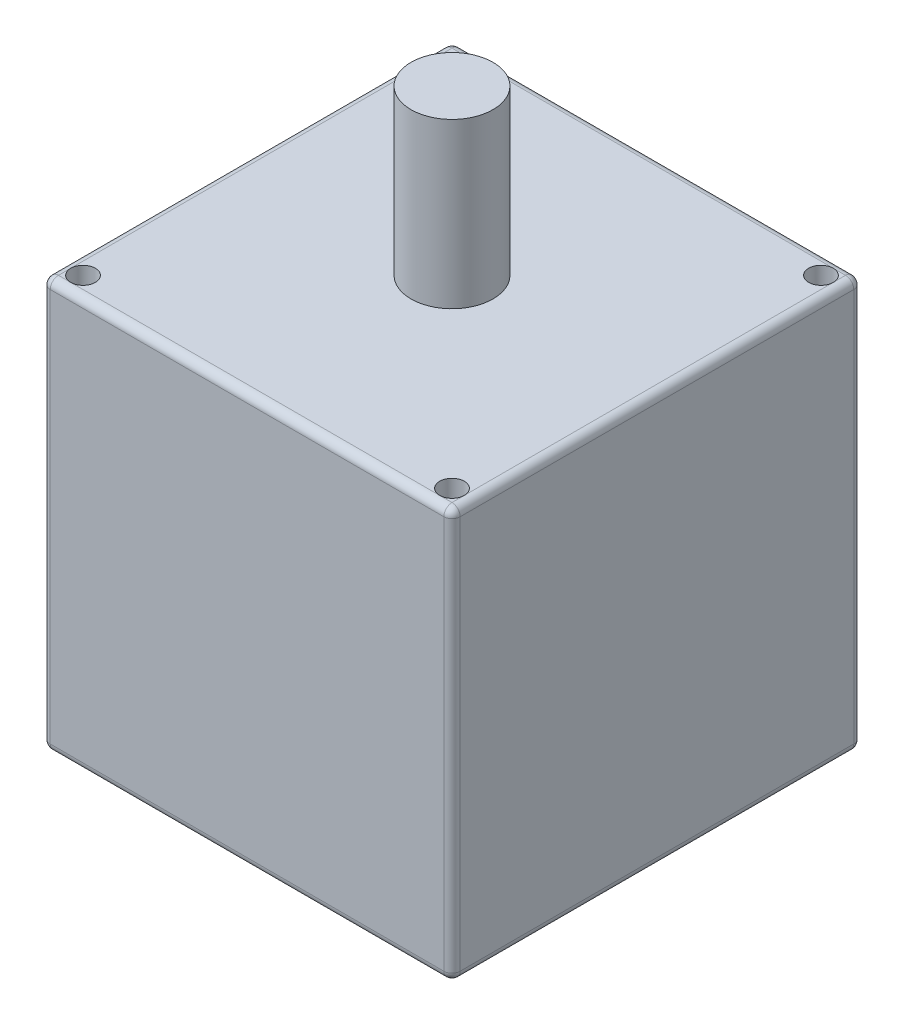
ISO-10303-21;
HEADER;
FILE_DESCRIPTION(('STEP AP214'),'2;1');
FILE_NAME('part.step','',(''),(''),'','','');
FILE_SCHEMA(('AUTOMOTIVE_DESIGN { 1 0 10303 214 1 1 1 1 }'));
ENDSEC;
DATA;
#1=APPLICATION_CONTEXT('core data for automotive mechanical design processes');
#2=APPLICATION_PROTOCOL_DEFINITION('international standard','automotive_design',2000,#1);
#3=PRODUCT_CONTEXT('',#1,'mechanical');
#4=PRODUCT('Part','Part','',(#3));
#5=PRODUCT_RELATED_PRODUCT_CATEGORY('part','',(#4));
#6=PRODUCT_DEFINITION_FORMATION('','',#4);
#7=PRODUCT_DEFINITION_CONTEXT('part definition',#1,'design');
#8=PRODUCT_DEFINITION('design','',#6,#7);
#9=PRODUCT_DEFINITION_SHAPE('','',#8);
#10=(LENGTH_UNIT() NAMED_UNIT(*) SI_UNIT(.MILLI.,.METRE.));
#11=(NAMED_UNIT(*) PLANE_ANGLE_UNIT() SI_UNIT($,.RADIAN.));
#12=(NAMED_UNIT(*) SI_UNIT($,.STERADIAN.) SOLID_ANGLE_UNIT());
#13=UNCERTAINTY_MEASURE_WITH_UNIT(LENGTH_MEASURE(1.E-05),#10,'distance_accuracy_value','');
#14=(GEOMETRIC_REPRESENTATION_CONTEXT(3) GLOBAL_UNCERTAINTY_ASSIGNED_CONTEXT((#13)) GLOBAL_UNIT_ASSIGNED_CONTEXT((#10,
#11,#12)) REPRESENTATION_CONTEXT('',''));
#15=CARTESIAN_POINT('',(0.,0.,0.));
#16=DIRECTION('',(0.,0.,1.));
#17=DIRECTION('',(1.,0.,0.));
#18=AXIS2_PLACEMENT_3D('',#15,#16,#17);
#19=CARTESIAN_POINT('',(0.,50.,0.));
#20=DIRECTION('',(0.,1.,0.));
#21=DIRECTION('',(0.,0.,1.));
#22=AXIS2_PLACEMENT_3D('',#19,#20,#21);
#23=PLANE('',#22);
#24=CARTESIAN_POINT('',(-22.5,50.,-22.5));
#25=DIRECTION('',(0.,1.,0.));
#26=DIRECTION('',(0.,0.,1.));
#27=AXIS2_PLACEMENT_3D('',#24,#25,#26);
#28=CIRCLE('',#27,1.49999999999999);
#29=CARTESIAN_POINT('',(-22.5,50.,-24.));
#30=VERTEX_POINT('',#29);
#31=CARTESIAN_POINT('',(-24.,50.,-22.5));
#32=VERTEX_POINT('',#31);
#33=EDGE_CURVE('E53',#30,#32,#28,.T.);
#34=ORIENTED_EDGE('',*,*,#33,.F.);
#35=DIRECTION('',(-1.,0.,0.));
#36=VECTOR('',#35,1.);
#37=CARTESIAN_POINT('',(-25.,50.,-24.));
#38=LINE('',#37,#36);
#39=CARTESIAN_POINT('',(-24.,50.,-24.));
#40=VERTEX_POINT('',#39);
#41=EDGE_CURVE('E245',#30,#40,#38,.T.);
#42=ORIENTED_EDGE('',*,*,#41,.T.);
#43=DIRECTION('',(0.,0.,1.));
#44=VECTOR('',#43,1.);
#45=CARTESIAN_POINT('',(-24.,50.,25.));
#46=LINE('',#45,#44);
#47=EDGE_CURVE('E252',#40,#32,#46,.T.);
#48=ORIENTED_EDGE('',*,*,#47,.T.);
#49=EDGE_LOOP('',(#34,#42,#48));
#50=FACE_BOUND('',#49,.T.);
#51=ADVANCED_FACE('F36',(#50),#23,.T.);
#52=CARTESIAN_POINT('',(22.5,50.,-22.5));
#53=DIRECTION('',(0.,1.,0.));
#54=DIRECTION('',(0.,0.,1.));
#55=AXIS2_PLACEMENT_3D('',#52,#53,#54);
#56=CIRCLE('',#55,1.49999999999999);
#57=CARTESIAN_POINT('',(24.,50.,-22.5));
#58=VERTEX_POINT('',#57);
#59=CARTESIAN_POINT('',(22.5,50.,-24.));
#60=VERTEX_POINT('',#59);
#61=EDGE_CURVE('E60',#58,#60,#56,.T.);
#62=ORIENTED_EDGE('',*,*,#61,.F.);
#63=DIRECTION('',(0.,0.,-1.));
#64=VECTOR('',#63,1.);
#65=CARTESIAN_POINT('',(24.,50.,-25.));
#66=LINE('',#65,#64);
#67=CARTESIAN_POINT('',(24.,50.,-24.));
#68=VERTEX_POINT('',#67);
#69=EDGE_CURVE('E241',#58,#68,#66,.T.);
#70=ORIENTED_EDGE('',*,*,#69,.T.);
#71=EDGE_CURVE('E247',#68,#60,#38,.T.);
#72=ORIENTED_EDGE('',*,*,#71,.T.);
#73=EDGE_LOOP('',(#62,#70,#72));
#74=FACE_BOUND('',#73,.T.);
#75=ADVANCED_FACE('F374',(#74),#23,.T.);
#76=CARTESIAN_POINT('',(22.5,50.,22.5));
#77=DIRECTION('',(0.,1.,0.));
#78=DIRECTION('',(0.,0.,1.));
#79=AXIS2_PLACEMENT_3D('',#76,#77,#78);
#80=CIRCLE('',#79,1.49999999999999);
#81=CARTESIAN_POINT('',(22.5,50.,24.));
#82=VERTEX_POINT('',#81);
#83=CARTESIAN_POINT('',(24.,50.,22.5));
#84=VERTEX_POINT('',#83);
#85=EDGE_CURVE('E183',#82,#84,#80,.T.);
#86=ORIENTED_EDGE('',*,*,#85,.F.);
#87=DIRECTION('',(1.,0.,0.));
#88=VECTOR('',#87,1.);
#89=CARTESIAN_POINT('',(25.,50.,24.));
#90=LINE('',#89,#88);
#91=CARTESIAN_POINT('',(24.,50.,24.));
#92=VERTEX_POINT('',#91);
#93=EDGE_CURVE('E47',#82,#92,#90,.T.);
#94=ORIENTED_EDGE('',*,*,#93,.T.);
#95=EDGE_CURVE('E242',#92,#84,#66,.T.);
#96=ORIENTED_EDGE('',*,*,#95,.T.);
#97=EDGE_LOOP('',(#86,#94,#96));
#98=FACE_BOUND('',#97,.T.);
#99=ADVANCED_FACE('F383',(#98),#23,.T.);
#100=CARTESIAN_POINT('',(0.,50.,0.));
#101=DIRECTION('',(0.,1.,0.));
#102=DIRECTION('',(0.,0.,1.));
#103=AXIS2_PLACEMENT_3D('',#100,#101,#102);
#104=CIRCLE('',#103,5.);
#105=CARTESIAN_POINT('',(0.,50.,5.));
#106=VERTEX_POINT('',#105);
#107=EDGE_CURVE('E431',#106,#106,#104,.T.);
#108=ORIENTED_EDGE('',*,*,#107,.F.);
#109=EDGE_LOOP('',(#108));
#110=FACE_BOUND('',#109,.T.);
#111=EDGE_CURVE('E175',#32,#30,#28,.T.);
#112=ORIENTED_EDGE('',*,*,#111,.F.);
#113=CARTESIAN_POINT('',(-24.,50.,22.5));
#114=VERTEX_POINT('',#113);
#115=EDGE_CURVE('E254',#32,#114,#46,.T.);
#116=ORIENTED_EDGE('',*,*,#115,.T.);
#117=CARTESIAN_POINT('',(-22.5,50.,22.5));
#118=DIRECTION('',(0.,1.,0.));
#119=DIRECTION('',(0.,0.,1.));
#120=AXIS2_PLACEMENT_3D('',#117,#118,#119);
#121=CIRCLE('',#120,1.49999999999999);
#122=CARTESIAN_POINT('',(-22.5,50.,24.));
#123=VERTEX_POINT('',#122);
#124=EDGE_CURVE('E189',#123,#114,#121,.T.);
#125=ORIENTED_EDGE('',*,*,#124,.F.);
#126=EDGE_CURVE('E45',#123,#82,#90,.T.);
#127=ORIENTED_EDGE('',*,*,#126,.T.);
#128=EDGE_CURVE('E182',#84,#82,#80,.T.);
#129=ORIENTED_EDGE('',*,*,#128,.F.);
#130=EDGE_CURVE('E246',#84,#58,#66,.T.);
#131=ORIENTED_EDGE('',*,*,#130,.T.);
#132=EDGE_CURVE('E172',#60,#58,#56,.T.);
#133=ORIENTED_EDGE('',*,*,#132,.F.);
#134=EDGE_CURVE('E251',#60,#30,#38,.T.);
#135=ORIENTED_EDGE('',*,*,#134,.T.);
#136=EDGE_LOOP('',(#112,#116,#125,#127,#129,#131,#133,#135));
#137=FACE_BOUND('',#136,.T.);
#138=ADVANCED_FACE('F379',(#110,#137),#23,.T.);
#139=CARTESIAN_POINT('',(25.,50.,-25.));
#140=DIRECTION('',(-1.,0.,0.));
#141=DIRECTION('',(0.,0.,1.));
#142=AXIS2_PLACEMENT_3D('',#139,#140,#141);
#143=PLANE('',#142);
#144=DIRECTION('',(0.,0.,-1.));
#145=VECTOR('',#144,1.);
#146=CARTESIAN_POINT('',(25.,1.,-25.));
#147=LINE('',#146,#145);
#148=CARTESIAN_POINT('',(25.,1.,24.));
#149=VERTEX_POINT('',#148);
#150=CARTESIAN_POINT('',(25.,1.,-24.));
#151=VERTEX_POINT('',#150);
#152=EDGE_CURVE('E227',#149,#151,#147,.T.);
#153=ORIENTED_EDGE('',*,*,#152,.T.);
#154=DIRECTION('',(0.,-1.,0.));
#155=VECTOR('',#154,1.);
#156=CARTESIAN_POINT('',(25.,50.,-24.));
#157=LINE('',#156,#155);
#158=CARTESIAN_POINT('',(25.,49.,-24.));
#159=VERTEX_POINT('',#158);
#160=EDGE_CURVE('E229',#151,#159,#157,.F.);
#161=ORIENTED_EDGE('',*,*,#160,.T.);
#162=DIRECTION('',(0.,0.,-1.));
#163=VECTOR('',#162,1.);
#164=CARTESIAN_POINT('',(25.,49.,25.));
#165=LINE('',#164,#163);
#166=CARTESIAN_POINT('',(25.,49.,24.));
#167=VERTEX_POINT('',#166);
#168=EDGE_CURVE('E223',#159,#167,#165,.F.);
#169=ORIENTED_EDGE('',*,*,#168,.T.);
#170=DIRECTION('',(0.,-1.,0.));
#171=VECTOR('',#170,1.);
#172=CARTESIAN_POINT('',(25.,50.,24.));
#173=LINE('',#172,#171);
#174=EDGE_CURVE('E225',#167,#149,#173,.T.);
#175=ORIENTED_EDGE('',*,*,#174,.T.);
#176=EDGE_LOOP('',(#153,#161,#169,#175));
#177=FACE_BOUND('',#176,.T.);
#178=ADVANCED_FACE('F335',(#177),#143,.F.);
#179=CARTESIAN_POINT('',(-25.,50.,-25.));
#180=DIRECTION('',(0.,0.,1.));
#181=DIRECTION('',(1.,0.,0.));
#182=AXIS2_PLACEMENT_3D('',#179,#180,#181);
#183=PLANE('',#182);
#184=DIRECTION('',(-1.,0.,0.));
#185=VECTOR('',#184,1.);
#186=CARTESIAN_POINT('',(-25.,1.,-25.));
#187=LINE('',#186,#185);
#188=CARTESIAN_POINT('',(24.,1.,-25.));
#189=VERTEX_POINT('',#188);
#190=CARTESIAN_POINT('',(-24.,1.,-25.));
#191=VERTEX_POINT('',#190);
#192=EDGE_CURVE('E218',#189,#191,#187,.T.);
#193=ORIENTED_EDGE('',*,*,#192,.T.);
#194=DIRECTION('',(0.,-1.,0.));
#195=VECTOR('',#194,1.);
#196=CARTESIAN_POINT('',(-24.,50.,-25.));
#197=LINE('',#196,#195);
#198=CARTESIAN_POINT('',(-24.,49.,-25.));
#199=VERTEX_POINT('',#198);
#200=EDGE_CURVE('E220',#191,#199,#197,.F.);
#201=ORIENTED_EDGE('',*,*,#200,.T.);
#202=DIRECTION('',(-1.,0.,0.));
#203=VECTOR('',#202,1.);
#204=CARTESIAN_POINT('',(25.,49.,-25.));
#205=LINE('',#204,#203);
#206=CARTESIAN_POINT('',(24.,49.,-25.));
#207=VERTEX_POINT('',#206);
#208=EDGE_CURVE('E214',#199,#207,#205,.F.);
#209=ORIENTED_EDGE('',*,*,#208,.T.);
#210=DIRECTION('',(0.,-1.,0.));
#211=VECTOR('',#210,1.);
#212=CARTESIAN_POINT('',(24.,50.,-25.));
#213=LINE('',#212,#211);
#214=EDGE_CURVE('E216',#207,#189,#213,.T.);
#215=ORIENTED_EDGE('',*,*,#214,.T.);
#216=EDGE_LOOP('',(#193,#201,#209,#215));
#217=FACE_BOUND('',#216,.T.);
#218=ADVANCED_FACE('F356',(#217),#183,.F.);
#219=CARTESIAN_POINT('',(-25.,50.,-25.));
#220=DIRECTION('',(1.,0.,0.));
#221=DIRECTION('',(0.,0.,-1.));
#222=AXIS2_PLACEMENT_3D('',#219,#220,#221);
#223=PLANE('',#222);
#224=DIRECTION('',(0.,-1.,0.));
#225=VECTOR('',#224,1.);
#226=CARTESIAN_POINT('',(-25.,50.,-24.));
#227=LINE('',#226,#225);
#228=CARTESIAN_POINT('',(-25.,49.,-24.));
#229=VERTEX_POINT('',#228);
#230=CARTESIAN_POINT('',(-25.,1.,-24.));
#231=VERTEX_POINT('',#230);
#232=EDGE_CURVE('E200',#229,#231,#227,.T.);
#233=ORIENTED_EDGE('',*,*,#232,.T.);
#234=DIRECTION('',(0.,0.,1.));
#235=VECTOR('',#234,1.);
#236=CARTESIAN_POINT('',(-25.,1.,-25.));
#237=LINE('',#236,#235);
#238=CARTESIAN_POINT('',(-25.,1.,24.));
#239=VERTEX_POINT('',#238);
#240=EDGE_CURVE('E202',#231,#239,#237,.T.);
#241=ORIENTED_EDGE('',*,*,#240,.T.);
#242=DIRECTION('',(0.,-1.,0.));
#243=VECTOR('',#242,1.);
#244=CARTESIAN_POINT('',(-25.,50.,24.));
#245=LINE('',#244,#243);
#246=CARTESIAN_POINT('',(-25.,49.,24.));
#247=VERTEX_POINT('',#246);
#248=EDGE_CURVE('E198',#239,#247,#245,.F.);
#249=ORIENTED_EDGE('',*,*,#248,.T.);
#250=DIRECTION('',(0.,0.,1.));
#251=VECTOR('',#250,1.);
#252=CARTESIAN_POINT('',(-25.,49.,-25.));
#253=LINE('',#252,#251);
#254=EDGE_CURVE('E196',#247,#229,#253,.F.);
#255=ORIENTED_EDGE('',*,*,#254,.T.);
#256=EDGE_LOOP('',(#233,#241,#249,#255));
#257=FACE_BOUND('',#256,.T.);
#258=ADVANCED_FACE('F420',(#257),#223,.F.);
#259=CARTESIAN_POINT('',(-25.,50.,25.));
#260=DIRECTION('',(0.,0.,-1.));
#261=DIRECTION('',(-1.,0.,0.));
#262=AXIS2_PLACEMENT_3D('',#259,#260,#261);
#263=PLANE('',#262);
#264=DIRECTION('',(0.,-1.,0.));
#265=VECTOR('',#264,1.);
#266=CARTESIAN_POINT('',(-24.,50.,25.));
#267=LINE('',#266,#265);
#268=CARTESIAN_POINT('',(-24.,49.,25.));
#269=VERTEX_POINT('',#268);
#270=CARTESIAN_POINT('',(-24.,1.,25.));
#271=VERTEX_POINT('',#270);
#272=EDGE_CURVE('E236',#269,#271,#267,.T.);
#273=ORIENTED_EDGE('',*,*,#272,.T.);
#274=DIRECTION('',(1.,0.,0.));
#275=VECTOR('',#274,1.);
#276=CARTESIAN_POINT('',(-25.,1.,25.));
#277=LINE('',#276,#275);
#278=CARTESIAN_POINT('',(24.,1.,25.));
#279=VERTEX_POINT('',#278);
#280=EDGE_CURVE('E239',#271,#279,#277,.T.);
#281=ORIENTED_EDGE('',*,*,#280,.T.);
#282=DIRECTION('',(0.,-1.,0.));
#283=VECTOR('',#282,1.);
#284=CARTESIAN_POINT('',(24.,50.,25.));
#285=LINE('',#284,#283);
#286=CARTESIAN_POINT('',(24.,49.,25.));
#287=VERTEX_POINT('',#286);
#288=EDGE_CURVE('E234',#279,#287,#285,.F.);
#289=ORIENTED_EDGE('',*,*,#288,.T.);
#290=DIRECTION('',(1.,0.,0.));
#291=VECTOR('',#290,1.);
#292=CARTESIAN_POINT('',(-25.,49.,25.));
#293=LINE('',#292,#291);
#294=EDGE_CURVE('E232',#287,#269,#293,.F.);
#295=ORIENTED_EDGE('',*,*,#294,.T.);
#296=EDGE_LOOP('',(#273,#281,#289,#295));
#297=FACE_BOUND('',#296,.T.);
#298=ADVANCED_FACE('F451',(#297),#263,.F.);
#299=EDGE_CURVE('E188',#114,#123,#121,.T.);
#300=ORIENTED_EDGE('',*,*,#299,.F.);
#301=CARTESIAN_POINT('',(-24.,50.,24.));
#302=VERTEX_POINT('',#301);
#303=EDGE_CURVE('E250',#114,#302,#46,.T.);
#304=ORIENTED_EDGE('',*,*,#303,.T.);
#305=EDGE_CURVE('E11',#302,#123,#90,.T.);
#306=ORIENTED_EDGE('',*,*,#305,.T.);
#307=EDGE_LOOP('',(#300,#304,#306));
#308=FACE_BOUND('',#307,.T.);
#309=ADVANCED_FACE('F442',(#308),#23,.T.);
#310=CARTESIAN_POINT('',(0.,0.,0.));
#311=DIRECTION('',(0.,1.,0.));
#312=DIRECTION('',(0.,0.,1.));
#313=AXIS2_PLACEMENT_3D('',#310,#311,#312);
#314=PLANE('',#313);
#315=DIRECTION('',(1.,0.,0.));
#316=VECTOR('',#315,1.);
#317=CARTESIAN_POINT('',(0.,0.,24.));
#318=LINE('',#317,#316);
#319=CARTESIAN_POINT('',(24.,0.,24.));
#320=VERTEX_POINT('',#319);
#321=CARTESIAN_POINT('',(-24.,0.,24.));
#322=VERTEX_POINT('',#321);
#323=EDGE_CURVE('E205',#320,#322,#318,.F.);
#324=ORIENTED_EDGE('',*,*,#323,.T.);
#325=DIRECTION('',(0.,0.,1.));
#326=VECTOR('',#325,1.);
#327=CARTESIAN_POINT('',(-24.,0.,0.));
#328=LINE('',#327,#326);
#329=CARTESIAN_POINT('',(-24.,0.,-24.));
#330=VERTEX_POINT('',#329);
#331=EDGE_CURVE('E211',#322,#330,#328,.F.);
#332=ORIENTED_EDGE('',*,*,#331,.T.);
#333=DIRECTION('',(-1.,0.,0.));
#334=VECTOR('',#333,1.);
#335=CARTESIAN_POINT('',(0.,0.,-24.));
#336=LINE('',#335,#334);
#337=CARTESIAN_POINT('',(24.,0.,-24.));
#338=VERTEX_POINT('',#337);
#339=EDGE_CURVE('E209',#330,#338,#336,.F.);
#340=ORIENTED_EDGE('',*,*,#339,.T.);
#341=DIRECTION('',(0.,0.,-1.));
#342=VECTOR('',#341,1.);
#343=CARTESIAN_POINT('',(24.,0.,0.));
#344=LINE('',#343,#342);
#345=EDGE_CURVE('E207',#338,#320,#344,.F.);
#346=ORIENTED_EDGE('',*,*,#345,.T.);
#347=EDGE_LOOP('',(#324,#332,#340,#346));
#348=FACE_BOUND('',#347,.T.);
#349=ADVANCED_FACE('F405',(#348),#314,.F.);
#350=CARTESIAN_POINT('',(24.,49.,0.));
#351=DIRECTION('',(0.,0.,1.));
#352=DIRECTION('',(1.,0.,0.));
#353=AXIS2_PLACEMENT_3D('',#350,#351,#352);
#354=CYLINDRICAL_SURFACE('',#353,1.);
#355=CARTESIAN_POINT('',(24.,49.,-24.));
#356=DIRECTION('',(0.,0.,-1.));
#357=DIRECTION('',(-1.,0.,0.));
#358=AXIS2_PLACEMENT_3D('',#355,#356,#357);
#359=CIRCLE('',#358,1.);
#360=EDGE_CURVE('E40',#68,#159,#359,.T.);
#361=ORIENTED_EDGE('',*,*,#360,.F.);
#362=ORIENTED_EDGE('',*,*,#69,.F.);
#363=ORIENTED_EDGE('',*,*,#130,.F.);
#364=ORIENTED_EDGE('',*,*,#95,.F.);
#365=CARTESIAN_POINT('',(24.,49.,24.));
#366=DIRECTION('',(0.,0.,1.));
#367=DIRECTION('',(1.,0.,0.));
#368=AXIS2_PLACEMENT_3D('',#365,#366,#367);
#369=CIRCLE('',#368,1.);
#370=EDGE_CURVE('E315',#167,#92,#369,.T.);
#371=ORIENTED_EDGE('',*,*,#370,.F.);
#372=ORIENTED_EDGE('',*,*,#168,.F.);
#373=EDGE_LOOP('',(#361,#362,#363,#364,#371,#372));
#374=FACE_BOUND('',#373,.T.);
#375=ADVANCED_FACE('F38',(#374),#354,.T.);
#376=CARTESIAN_POINT('',(24.,49.,-24.));
#377=DIRECTION('',(0.,0.,1.));
#378=DIRECTION('',(1.,0.,0.));
#379=AXIS2_PLACEMENT_3D('',#376,#377,#378);
#380=SPHERICAL_SURFACE('',#379,1.);
#381=CARTESIAN_POINT('',(24.,49.,-24.));
#382=DIRECTION('',(1.,0.,0.));
#383=DIRECTION('',(0.,0.,-1.));
#384=AXIS2_PLACEMENT_3D('',#381,#382,#383);
#385=CIRCLE('',#384,1.);
#386=EDGE_CURVE('E311',#68,#207,#385,.F.);
#387=ORIENTED_EDGE('',*,*,#386,.F.);
#388=ORIENTED_EDGE('',*,*,#360,.T.);
#389=CARTESIAN_POINT('',(24.,49.,-24.));
#390=DIRECTION('',(0.,1.,0.));
#391=DIRECTION('',(0.,0.,1.));
#392=AXIS2_PLACEMENT_3D('',#389,#390,#391);
#393=CIRCLE('',#392,1.);
#394=EDGE_CURVE('E314',#207,#159,#393,.F.);
#395=ORIENTED_EDGE('',*,*,#394,.F.);
#396=EDGE_LOOP('',(#387,#388,#395));
#397=FACE_BOUND('',#396,.T.);
#398=ADVANCED_FACE('F328',(#397),#380,.T.);
#399=CARTESIAN_POINT('',(24.,49.,24.));
#400=DIRECTION('',(0.,0.,1.));
#401=DIRECTION('',(1.,0.,0.));
#402=AXIS2_PLACEMENT_3D('',#399,#400,#401);
#403=SPHERICAL_SURFACE('',#402,1.);
#404=CARTESIAN_POINT('',(24.,49.,24.));
#405=DIRECTION('',(0.,1.,0.));
#406=DIRECTION('',(0.,0.,1.));
#407=AXIS2_PLACEMENT_3D('',#404,#405,#406);
#408=CIRCLE('',#407,1.);
#409=EDGE_CURVE('E305',#167,#287,#408,.F.);
#410=ORIENTED_EDGE('',*,*,#409,.F.);
#411=ORIENTED_EDGE('',*,*,#370,.T.);
#412=CARTESIAN_POINT('',(24.,49.,24.));
#413=DIRECTION('',(1.,0.,0.));
#414=DIRECTION('',(0.,0.,-1.));
#415=AXIS2_PLACEMENT_3D('',#412,#413,#414);
#416=CIRCLE('',#415,1.);
#417=EDGE_CURVE('E308',#287,#92,#416,.F.);
#418=ORIENTED_EDGE('',*,*,#417,.F.);
#419=EDGE_LOOP('',(#410,#411,#418));
#420=FACE_BOUND('',#419,.T.);
#421=ADVANCED_FACE('F390',(#420),#403,.T.);
#422=CARTESIAN_POINT('',(24.,50.,-24.));
#423=DIRECTION('',(0.,-1.,0.));
#424=DIRECTION('',(0.,0.,-1.));
#425=AXIS2_PLACEMENT_3D('',#422,#423,#424);
#426=CYLINDRICAL_SURFACE('',#425,1.);
#427=ORIENTED_EDGE('',*,*,#394,.T.);
#428=ORIENTED_EDGE('',*,*,#160,.F.);
#429=CARTESIAN_POINT('',(24.,1.,-24.));
#430=DIRECTION('',(0.,-1.,0.));
#431=DIRECTION('',(0.,0.,-1.));
#432=AXIS2_PLACEMENT_3D('',#429,#430,#431);
#433=CIRCLE('',#432,1.);
#434=EDGE_CURVE('E299',#189,#151,#433,.T.);
#435=ORIENTED_EDGE('',*,*,#434,.F.);
#436=ORIENTED_EDGE('',*,*,#214,.F.);
#437=EDGE_LOOP('',(#427,#428,#435,#436));
#438=FACE_BOUND('',#437,.T.);
#439=ADVANCED_FACE('F340',(#438),#426,.T.);
#440=CARTESIAN_POINT('',(0.,49.,-24.));
#441=DIRECTION('',(1.,0.,0.));
#442=DIRECTION('',(0.,0.,-1.));
#443=AXIS2_PLACEMENT_3D('',#440,#441,#442);
#444=CYLINDRICAL_SURFACE('',#443,1.);
#445=ORIENTED_EDGE('',*,*,#386,.T.);
#446=ORIENTED_EDGE('',*,*,#208,.F.);
#447=CARTESIAN_POINT('',(-24.,49.,-24.));
#448=DIRECTION('',(-1.,0.,0.));
#449=DIRECTION('',(0.,0.,1.));
#450=AXIS2_PLACEMENT_3D('',#447,#448,#449);
#451=CIRCLE('',#450,1.);
#452=EDGE_CURVE('E296',#40,#199,#451,.T.);
#453=ORIENTED_EDGE('',*,*,#452,.F.);
#454=ORIENTED_EDGE('',*,*,#41,.F.);
#455=ORIENTED_EDGE('',*,*,#134,.F.);
#456=ORIENTED_EDGE('',*,*,#71,.F.);
#457=EDGE_LOOP('',(#445,#446,#453,#454,#455,#456));
#458=FACE_BOUND('',#457,.T.);
#459=ADVANCED_FACE('F370',(#458),#444,.T.);
#460=CARTESIAN_POINT('',(-24.,49.,0.));
#461=DIRECTION('',(0.,0.,-1.));
#462=DIRECTION('',(-1.,0.,0.));
#463=AXIS2_PLACEMENT_3D('',#460,#461,#462);
#464=CYLINDRICAL_SURFACE('',#463,1.);
#465=CARTESIAN_POINT('',(-24.,49.,24.));
#466=DIRECTION('',(0.,0.,1.));
#467=DIRECTION('',(1.,0.,0.));
#468=AXIS2_PLACEMENT_3D('',#465,#466,#467);
#469=CIRCLE('',#468,1.);
#470=EDGE_CURVE('E290',#302,#247,#469,.T.);
#471=ORIENTED_EDGE('',*,*,#470,.F.);
#472=ORIENTED_EDGE('',*,*,#303,.F.);
#473=ORIENTED_EDGE('',*,*,#115,.F.);
#474=ORIENTED_EDGE('',*,*,#47,.F.);
#475=CARTESIAN_POINT('',(-24.,49.,-24.));
#476=DIRECTION('',(0.,0.,-1.));
#477=DIRECTION('',(-1.,0.,0.));
#478=AXIS2_PLACEMENT_3D('',#475,#476,#477);
#479=CIRCLE('',#478,1.);
#480=EDGE_CURVE('E293',#229,#40,#479,.T.);
#481=ORIENTED_EDGE('',*,*,#480,.F.);
#482=ORIENTED_EDGE('',*,*,#254,.F.);
#483=EDGE_LOOP('',(#471,#472,#473,#474,#481,#482));
#484=FACE_BOUND('',#483,.T.);
#485=ADVANCED_FACE('F424',(#484),#464,.T.);
#486=CARTESIAN_POINT('',(0.,49.,24.));
#487=DIRECTION('',(-1.,0.,0.));
#488=DIRECTION('',(0.,0.,1.));
#489=AXIS2_PLACEMENT_3D('',#486,#487,#488);
#490=CYLINDRICAL_SURFACE('',#489,1.);
#491=ORIENTED_EDGE('',*,*,#417,.T.);
#492=ORIENTED_EDGE('',*,*,#93,.F.);
#493=ORIENTED_EDGE('',*,*,#126,.F.);
#494=ORIENTED_EDGE('',*,*,#305,.F.);
#495=CARTESIAN_POINT('',(-24.,49.,24.));
#496=DIRECTION('',(-1.,0.,0.));
#497=DIRECTION('',(0.,0.,1.));
#498=AXIS2_PLACEMENT_3D('',#495,#496,#497);
#499=CIRCLE('',#498,1.);
#500=EDGE_CURVE('E287',#269,#302,#499,.T.);
#501=ORIENTED_EDGE('',*,*,#500,.F.);
#502=ORIENTED_EDGE('',*,*,#294,.F.);
#503=EDGE_LOOP('',(#491,#492,#493,#494,#501,#502));
#504=FACE_BOUND('',#503,.T.);
#505=ADVANCED_FACE('F388',(#504),#490,.T.);
#506=CARTESIAN_POINT('',(24.,50.,24.));
#507=DIRECTION('',(0.,-1.,0.));
#508=DIRECTION('',(0.,0.,-1.));
#509=AXIS2_PLACEMENT_3D('',#506,#507,#508);
#510=CYLINDRICAL_SURFACE('',#509,1.);
#511=ORIENTED_EDGE('',*,*,#409,.T.);
#512=ORIENTED_EDGE('',*,*,#288,.F.);
#513=CARTESIAN_POINT('',(24.,1.,24.));
#514=DIRECTION('',(0.,-1.,0.));
#515=DIRECTION('',(0.,0.,-1.));
#516=AXIS2_PLACEMENT_3D('',#513,#514,#515);
#517=CIRCLE('',#516,1.);
#518=EDGE_CURVE('E284',#149,#279,#517,.T.);
#519=ORIENTED_EDGE('',*,*,#518,.F.);
#520=ORIENTED_EDGE('',*,*,#174,.F.);
#521=EDGE_LOOP('',(#511,#512,#519,#520));
#522=FACE_BOUND('',#521,.T.);
#523=ADVANCED_FACE('F394',(#522),#510,.T.);
#524=CARTESIAN_POINT('',(24.,1.,-25.));
#525=DIRECTION('',(0.,0.,-1.));
#526=DIRECTION('',(-1.,0.,0.));
#527=AXIS2_PLACEMENT_3D('',#524,#525,#526);
#528=CYLINDRICAL_SURFACE('',#527,1.);
#529=CARTESIAN_POINT('',(24.,1.,-24.));
#530=DIRECTION('',(0.,0.,-1.));
#531=DIRECTION('',(-1.,0.,0.));
#532=AXIS2_PLACEMENT_3D('',#529,#530,#531);
#533=CIRCLE('',#532,1.);
#534=EDGE_CURVE('E302',#151,#338,#533,.T.);
#535=ORIENTED_EDGE('',*,*,#534,.F.);
#536=ORIENTED_EDGE('',*,*,#152,.F.);
#537=CARTESIAN_POINT('',(24.,1.,24.));
#538=DIRECTION('',(0.,0.,1.));
#539=DIRECTION('',(1.,0.,0.));
#540=AXIS2_PLACEMENT_3D('',#537,#538,#539);
#541=CIRCLE('',#540,1.);
#542=EDGE_CURVE('E281',#320,#149,#541,.T.);
#543=ORIENTED_EDGE('',*,*,#542,.F.);
#544=ORIENTED_EDGE('',*,*,#345,.F.);
#545=EDGE_LOOP('',(#535,#536,#543,#544));
#546=FACE_BOUND('',#545,.T.);
#547=ADVANCED_FACE('F344',(#546),#528,.T.);
#548=CARTESIAN_POINT('',(24.,1.,-24.));
#549=DIRECTION('',(0.,0.,1.));
#550=DIRECTION('',(1.,0.,0.));
#551=AXIS2_PLACEMENT_3D('',#548,#549,#550);
#552=SPHERICAL_SURFACE('',#551,1.);
#553=ORIENTED_EDGE('',*,*,#434,.T.);
#554=ORIENTED_EDGE('',*,*,#534,.T.);
#555=CARTESIAN_POINT('',(24.,1.,-24.));
#556=DIRECTION('',(1.,0.,0.));
#557=DIRECTION('',(0.,0.,-1.));
#558=AXIS2_PLACEMENT_3D('',#555,#556,#557);
#559=CIRCLE('',#558,1.);
#560=EDGE_CURVE('E278',#189,#338,#559,.F.);
#561=ORIENTED_EDGE('',*,*,#560,.F.);
#562=EDGE_LOOP('',(#553,#554,#561));
#563=FACE_BOUND('',#562,.T.);
#564=ADVANCED_FACE('F348',(#563),#552,.T.);
#565=CARTESIAN_POINT('',(-24.,49.,-24.));
#566=DIRECTION('',(0.,0.,1.));
#567=DIRECTION('',(1.,0.,0.));
#568=AXIS2_PLACEMENT_3D('',#565,#566,#567);
#569=SPHERICAL_SURFACE('',#568,1.);
#570=ORIENTED_EDGE('',*,*,#480,.T.);
#571=ORIENTED_EDGE('',*,*,#452,.T.);
#572=CARTESIAN_POINT('',(-24.,49.,-24.));
#573=DIRECTION('',(0.,1.,0.));
#574=DIRECTION('',(0.,0.,1.));
#575=AXIS2_PLACEMENT_3D('',#572,#573,#574);
#576=CIRCLE('',#575,1.);
#577=EDGE_CURVE('E276',#229,#199,#576,.F.);
#578=ORIENTED_EDGE('',*,*,#577,.F.);
#579=EDGE_LOOP('',(#570,#571,#578));
#580=FACE_BOUND('',#579,.T.);
#581=ADVANCED_FACE('F366',(#580),#569,.T.);
#582=CARTESIAN_POINT('',(-24.,49.,24.));
#583=DIRECTION('',(0.,0.,1.));
#584=DIRECTION('',(1.,0.,0.));
#585=AXIS2_PLACEMENT_3D('',#582,#583,#584);
#586=SPHERICAL_SURFACE('',#585,1.);
#587=ORIENTED_EDGE('',*,*,#500,.T.);
#588=ORIENTED_EDGE('',*,*,#470,.T.);
#589=CARTESIAN_POINT('',(-24.,49.,24.));
#590=DIRECTION('',(0.,1.,0.));
#591=DIRECTION('',(0.,0.,1.));
#592=AXIS2_PLACEMENT_3D('',#589,#590,#591);
#593=CIRCLE('',#592,1.);
#594=EDGE_CURVE('E273',#269,#247,#593,.F.);
#595=ORIENTED_EDGE('',*,*,#594,.F.);
#596=EDGE_LOOP('',(#587,#588,#595));
#597=FACE_BOUND('',#596,.T.);
#598=ADVANCED_FACE('F666',(#597),#586,.T.);
#599=CARTESIAN_POINT('',(24.,1.,24.));
#600=DIRECTION('',(0.,0.,1.));
#601=DIRECTION('',(1.,0.,0.));
#602=AXIS2_PLACEMENT_3D('',#599,#600,#601);
#603=SPHERICAL_SURFACE('',#602,1.);
#604=ORIENTED_EDGE('',*,*,#542,.T.);
#605=ORIENTED_EDGE('',*,*,#518,.T.);
#606=CARTESIAN_POINT('',(24.,1.,24.));
#607=DIRECTION('',(1.,0.,0.));
#608=DIRECTION('',(0.,0.,-1.));
#609=AXIS2_PLACEMENT_3D('',#606,#607,#608);
#610=CIRCLE('',#609,1.);
#611=EDGE_CURVE('E270',#320,#279,#610,.F.);
#612=ORIENTED_EDGE('',*,*,#611,.F.);
#613=EDGE_LOOP('',(#604,#605,#612));
#614=FACE_BOUND('',#613,.T.);
#615=ADVANCED_FACE('F397',(#614),#603,.T.);
#616=CARTESIAN_POINT('',(-25.,1.,-24.));
#617=DIRECTION('',(-1.,0.,0.));
#618=DIRECTION('',(0.,0.,1.));
#619=AXIS2_PLACEMENT_3D('',#616,#617,#618);
#620=CYLINDRICAL_SURFACE('',#619,1.);
#621=ORIENTED_EDGE('',*,*,#560,.T.);
#622=ORIENTED_EDGE('',*,*,#339,.F.);
#623=CARTESIAN_POINT('',(-24.,1.,-24.));
#624=DIRECTION('',(-1.,0.,0.));
#625=DIRECTION('',(0.,0.,1.));
#626=AXIS2_PLACEMENT_3D('',#623,#624,#625);
#627=CIRCLE('',#626,1.);
#628=EDGE_CURVE('E267',#191,#330,#627,.T.);
#629=ORIENTED_EDGE('',*,*,#628,.F.);
#630=ORIENTED_EDGE('',*,*,#192,.F.);
#631=EDGE_LOOP('',(#621,#622,#629,#630));
#632=FACE_BOUND('',#631,.T.);
#633=ADVANCED_FACE('F353',(#632),#620,.T.);
#634=CARTESIAN_POINT('',(-24.,50.,-24.));
#635=DIRECTION('',(0.,-1.,0.));
#636=DIRECTION('',(0.,0.,-1.));
#637=AXIS2_PLACEMENT_3D('',#634,#635,#636);
#638=CYLINDRICAL_SURFACE('',#637,1.);
#639=ORIENTED_EDGE('',*,*,#577,.T.);
#640=ORIENTED_EDGE('',*,*,#200,.F.);
#641=CARTESIAN_POINT('',(-24.,1.,-24.));
#642=DIRECTION('',(0.,-1.,0.));
#643=DIRECTION('',(0.,0.,-1.));
#644=AXIS2_PLACEMENT_3D('',#641,#642,#643);
#645=CIRCLE('',#644,1.);
#646=EDGE_CURVE('E264',#231,#191,#645,.T.);
#647=ORIENTED_EDGE('',*,*,#646,.F.);
#648=ORIENTED_EDGE('',*,*,#232,.F.);
#649=EDGE_LOOP('',(#639,#640,#647,#648));
#650=FACE_BOUND('',#649,.T.);
#651=ADVANCED_FACE('F359',(#650),#638,.T.);
#652=CARTESIAN_POINT('',(-24.,50.,24.));
#653=DIRECTION('',(0.,-1.,0.));
#654=DIRECTION('',(0.,0.,-1.));
#655=AXIS2_PLACEMENT_3D('',#652,#653,#654);
#656=CYLINDRICAL_SURFACE('',#655,1.);
#657=ORIENTED_EDGE('',*,*,#594,.T.);
#658=ORIENTED_EDGE('',*,*,#248,.F.);
#659=CARTESIAN_POINT('',(-24.,1.,24.));
#660=DIRECTION('',(0.,-1.,0.));
#661=DIRECTION('',(0.,0.,-1.));
#662=AXIS2_PLACEMENT_3D('',#659,#660,#661);
#663=CIRCLE('',#662,1.);
#664=EDGE_CURVE('E261',#271,#239,#663,.T.);
#665=ORIENTED_EDGE('',*,*,#664,.F.);
#666=ORIENTED_EDGE('',*,*,#272,.F.);
#667=EDGE_LOOP('',(#657,#658,#665,#666));
#668=FACE_BOUND('',#667,.T.);
#669=ADVANCED_FACE('F416',(#668),#656,.T.);
#670=CARTESIAN_POINT('',(-25.,1.,24.));
#671=DIRECTION('',(1.,0.,0.));
#672=DIRECTION('',(0.,0.,-1.));
#673=AXIS2_PLACEMENT_3D('',#670,#671,#672);
#674=CYLINDRICAL_SURFACE('',#673,1.);
#675=ORIENTED_EDGE('',*,*,#611,.T.);
#676=ORIENTED_EDGE('',*,*,#280,.F.);
#677=CARTESIAN_POINT('',(-24.,1.,24.));
#678=DIRECTION('',(-1.,0.,0.));
#679=DIRECTION('',(0.,0.,1.));
#680=AXIS2_PLACEMENT_3D('',#677,#678,#679);
#681=CIRCLE('',#680,1.);
#682=EDGE_CURVE('E259',#322,#271,#681,.T.);
#683=ORIENTED_EDGE('',*,*,#682,.F.);
#684=ORIENTED_EDGE('',*,*,#323,.F.);
#685=EDGE_LOOP('',(#675,#676,#683,#684));
#686=FACE_BOUND('',#685,.T.);
#687=ADVANCED_FACE('F402',(#686),#674,.T.);
#688=CARTESIAN_POINT('',(-24.,1.,-24.));
#689=DIRECTION('',(0.,0.,1.));
#690=DIRECTION('',(1.,0.,0.));
#691=AXIS2_PLACEMENT_3D('',#688,#689,#690);
#692=SPHERICAL_SURFACE('',#691,1.);
#693=ORIENTED_EDGE('',*,*,#646,.T.);
#694=ORIENTED_EDGE('',*,*,#628,.T.);
#695=CARTESIAN_POINT('',(-24.,1.,-24.));
#696=DIRECTION('',(0.,0.,-1.));
#697=DIRECTION('',(-1.,0.,0.));
#698=AXIS2_PLACEMENT_3D('',#695,#696,#697);
#699=CIRCLE('',#698,1.);
#700=EDGE_CURVE('E257',#231,#330,#699,.F.);
#701=ORIENTED_EDGE('',*,*,#700,.F.);
#702=EDGE_LOOP('',(#693,#694,#701));
#703=FACE_BOUND('',#702,.T.);
#704=ADVANCED_FACE('F622',(#703),#692,.T.);
#705=CARTESIAN_POINT('',(-24.,1.,24.));
#706=DIRECTION('',(0.,0.,1.));
#707=DIRECTION('',(1.,0.,0.));
#708=AXIS2_PLACEMENT_3D('',#705,#706,#707);
#709=SPHERICAL_SURFACE('',#708,1.);
#710=ORIENTED_EDGE('',*,*,#682,.T.);
#711=ORIENTED_EDGE('',*,*,#664,.T.);
#712=CARTESIAN_POINT('',(-24.,1.,24.));
#713=DIRECTION('',(0.,0.,1.));
#714=DIRECTION('',(1.,0.,0.));
#715=AXIS2_PLACEMENT_3D('',#712,#713,#714);
#716=CIRCLE('',#715,1.);
#717=EDGE_CURVE('E195',#322,#239,#716,.F.);
#718=ORIENTED_EDGE('',*,*,#717,.F.);
#719=EDGE_LOOP('',(#710,#711,#718));
#720=FACE_BOUND('',#719,.T.);
#721=ADVANCED_FACE('F411',(#720),#709,.T.);
#722=CARTESIAN_POINT('',(-24.,1.,-25.));
#723=DIRECTION('',(0.,0.,1.));
#724=DIRECTION('',(1.,0.,0.));
#725=AXIS2_PLACEMENT_3D('',#722,#723,#724);
#726=CYLINDRICAL_SURFACE('',#725,1.);
#727=ORIENTED_EDGE('',*,*,#700,.T.);
#728=ORIENTED_EDGE('',*,*,#331,.F.);
#729=ORIENTED_EDGE('',*,*,#717,.T.);
#730=ORIENTED_EDGE('',*,*,#240,.F.);
#731=EDGE_LOOP('',(#727,#728,#729,#730));
#732=FACE_BOUND('',#731,.T.);
#733=ADVANCED_FACE('F408',(#732),#726,.T.);
#734=CARTESIAN_POINT('',(-22.5,40.,22.5));
#735=DIRECTION('',(0.,1.,0.));
#736=DIRECTION('',(0.,0.,1.));
#737=AXIS2_PLACEMENT_3D('',#734,#735,#736);
#738=CONICAL_SURFACE('',#737,1.49999999999999,1.02974425867665);
#739=CARTESIAN_POINT('',(-22.5,39.0987090714587,22.5));
#740=VERTEX_POINT('',#739);
#741=VERTEX_LOOP('',#740);
#742=FACE_BOUND('',#741,.T.);
#743=CARTESIAN_POINT('',(-22.5,40.,22.5));
#744=DIRECTION('',(0.,1.,0.));
#745=DIRECTION('',(0.,0.,1.));
#746=AXIS2_PLACEMENT_3D('',#743,#744,#745);
#747=CIRCLE('',#746,1.49999999999999);
#748=CARTESIAN_POINT('',(-22.5,40.,24.));
#749=VERTEX_POINT('',#748);
#750=EDGE_CURVE('E192',#749,#749,#747,.T.);
#751=ORIENTED_EDGE('',*,*,#750,.T.);
#752=EDGE_LOOP('',(#751));
#753=FACE_BOUND('',#752,.T.);
#754=ADVANCED_FACE('F516',(#742,#753),#738,.F.);
#755=CARTESIAN_POINT('',(-22.5,50.,22.5));
#756=DIRECTION('',(0.,1.,0.));
#757=DIRECTION('',(0.,0.,1.));
#758=AXIS2_PLACEMENT_3D('',#755,#756,#757);
#759=CYLINDRICAL_SURFACE('',#758,1.49999999999999);
#760=ORIENTED_EDGE('',*,*,#750,.F.);
#761=EDGE_LOOP('',(#760));
#762=FACE_BOUND('',#761,.T.);
#763=ORIENTED_EDGE('',*,*,#124,.T.);
#764=ORIENTED_EDGE('',*,*,#299,.T.);
#765=EDGE_LOOP('',(#763,#764));
#766=FACE_BOUND('',#765,.T.);
#767=ADVANCED_FACE('F521',(#762,#766),#759,.F.);
#768=CARTESIAN_POINT('',(22.5,40.,22.5));
#769=DIRECTION('',(0.,1.,0.));
#770=DIRECTION('',(0.,0.,1.));
#771=AXIS2_PLACEMENT_3D('',#768,#769,#770);
#772=CONICAL_SURFACE('',#771,1.49999999999999,1.02974425867665);
#773=CARTESIAN_POINT('',(22.5,39.0987090714587,22.5));
#774=VERTEX_POINT('',#773);
#775=VERTEX_LOOP('',#774);
#776=FACE_BOUND('',#775,.T.);
#777=CARTESIAN_POINT('',(22.5,40.,22.5));
#778=DIRECTION('',(0.,1.,0.));
#779=DIRECTION('',(0.,0.,1.));
#780=AXIS2_PLACEMENT_3D('',#777,#778,#779);
#781=CIRCLE('',#780,1.49999999999999);
#782=CARTESIAN_POINT('',(22.5,40.,24.));
#783=VERTEX_POINT('',#782);
#784=EDGE_CURVE('E185',#783,#783,#781,.T.);
#785=ORIENTED_EDGE('',*,*,#784,.T.);
#786=EDGE_LOOP('',(#785));
#787=FACE_BOUND('',#786,.T.);
#788=ADVANCED_FACE('F532',(#776,#787),#772,.F.);
#789=CARTESIAN_POINT('',(22.5,50.,22.5));
#790=DIRECTION('',(0.,1.,0.));
#791=DIRECTION('',(0.,0.,1.));
#792=AXIS2_PLACEMENT_3D('',#789,#790,#791);
#793=CYLINDRICAL_SURFACE('',#792,1.49999999999999);
#794=ORIENTED_EDGE('',*,*,#784,.F.);
#795=EDGE_LOOP('',(#794));
#796=FACE_BOUND('',#795,.T.);
#797=ORIENTED_EDGE('',*,*,#85,.T.);
#798=ORIENTED_EDGE('',*,*,#128,.T.);
#799=EDGE_LOOP('',(#797,#798));
#800=FACE_BOUND('',#799,.T.);
#801=ADVANCED_FACE('F542',(#796,#800),#793,.F.);
#802=CARTESIAN_POINT('',(22.5,40.,-22.5));
#803=DIRECTION('',(0.,1.,0.));
#804=DIRECTION('',(0.,0.,1.));
#805=AXIS2_PLACEMENT_3D('',#802,#803,#804);
#806=CONICAL_SURFACE('',#805,1.49999999999999,1.02974425867665);
#807=CARTESIAN_POINT('',(22.5,39.0987090714587,-22.5));
#808=VERTEX_POINT('',#807);
#809=VERTEX_LOOP('',#808);
#810=FACE_BOUND('',#809,.T.);
#811=CARTESIAN_POINT('',(22.5,40.,-22.5));
#812=DIRECTION('',(0.,1.,0.));
#813=DIRECTION('',(0.,0.,1.));
#814=AXIS2_PLACEMENT_3D('',#811,#812,#813);
#815=CIRCLE('',#814,1.49999999999999);
#816=CARTESIAN_POINT('',(22.5,40.,-21.));
#817=VERTEX_POINT('',#816);
#818=EDGE_CURVE('E179',#817,#817,#815,.T.);
#819=ORIENTED_EDGE('',*,*,#818,.T.);
#820=EDGE_LOOP('',(#819));
#821=FACE_BOUND('',#820,.T.);
#822=ADVANCED_FACE('F552',(#810,#821),#806,.F.);
#823=CARTESIAN_POINT('',(22.5,50.,-22.5));
#824=DIRECTION('',(0.,1.,0.));
#825=DIRECTION('',(0.,0.,1.));
#826=AXIS2_PLACEMENT_3D('',#823,#824,#825);
#827=CYLINDRICAL_SURFACE('',#826,1.49999999999999);
#828=ORIENTED_EDGE('',*,*,#818,.F.);
#829=EDGE_LOOP('',(#828));
#830=FACE_BOUND('',#829,.T.);
#831=ORIENTED_EDGE('',*,*,#61,.T.);
#832=ORIENTED_EDGE('',*,*,#132,.T.);
#833=EDGE_LOOP('',(#831,#832));
#834=FACE_BOUND('',#833,.T.);
#835=ADVANCED_FACE('F166',(#830,#834),#827,.F.);
#836=CARTESIAN_POINT('',(-22.5,40.,-22.5));
#837=DIRECTION('',(0.,1.,0.));
#838=DIRECTION('',(0.,0.,1.));
#839=AXIS2_PLACEMENT_3D('',#836,#837,#838);
#840=CONICAL_SURFACE('',#839,1.49999999999999,1.02974425867665);
#841=CARTESIAN_POINT('',(-22.5,39.0987090714587,-22.5));
#842=VERTEX_POINT('',#841);
#843=VERTEX_LOOP('',#842);
#844=FACE_BOUND('',#843,.T.);
#845=CARTESIAN_POINT('',(-22.5,40.,-22.5));
#846=DIRECTION('',(0.,1.,0.));
#847=DIRECTION('',(0.,0.,1.));
#848=AXIS2_PLACEMENT_3D('',#845,#846,#847);
#849=CIRCLE('',#848,1.49999999999999);
#850=CARTESIAN_POINT('',(-22.5,40.,-21.));
#851=VERTEX_POINT('',#850);
#852=EDGE_CURVE('E170',#851,#851,#849,.T.);
#853=ORIENTED_EDGE('',*,*,#852,.T.);
#854=EDGE_LOOP('',(#853));
#855=FACE_BOUND('',#854,.T.);
#856=ADVANCED_FACE('F162',(#844,#855),#840,.F.);
#857=CARTESIAN_POINT('',(-22.5,50.,-22.5));
#858=DIRECTION('',(0.,1.,0.));
#859=DIRECTION('',(0.,0.,1.));
#860=AXIS2_PLACEMENT_3D('',#857,#858,#859);
#861=CYLINDRICAL_SURFACE('',#860,1.49999999999999);
#862=ORIENTED_EDGE('',*,*,#852,.F.);
#863=EDGE_LOOP('',(#862));
#864=FACE_BOUND('',#863,.T.);
#865=ORIENTED_EDGE('',*,*,#33,.T.);
#866=ORIENTED_EDGE('',*,*,#111,.T.);
#867=EDGE_LOOP('',(#865,#866));
#868=FACE_BOUND('',#867,.T.);
#869=ADVANCED_FACE('F165',(#864,#868),#861,.F.);
#870=CARTESIAN_POINT('',(0.,70.,0.));
#871=DIRECTION('',(0.,-1.,0.));
#872=DIRECTION('',(0.,0.,-1.));
#873=AXIS2_PLACEMENT_3D('',#870,#871,#872);
#874=CYLINDRICAL_SURFACE('',#873,5.);
#875=CARTESIAN_POINT('',(0.,70.,0.));
#876=DIRECTION('',(0.,1.,0.));
#877=DIRECTION('',(0.,0.,1.));
#878=AXIS2_PLACEMENT_3D('',#875,#876,#877);
#879=CIRCLE('',#878,5.);
#880=CARTESIAN_POINT('',(0.,70.,5.));
#881=VERTEX_POINT('',#880);
#882=EDGE_CURVE('E429',#881,#881,#879,.T.);
#883=ORIENTED_EDGE('',*,*,#882,.F.);
#884=EDGE_LOOP('',(#883));
#885=FACE_BOUND('',#884,.T.);
#886=ORIENTED_EDGE('',*,*,#107,.T.);
#887=EDGE_LOOP('',(#886));
#888=FACE_BOUND('',#887,.T.);
#889=ADVANCED_FACE('F438',(#885,#888),#874,.T.);
#890=CARTESIAN_POINT('',(0.,70.,0.));
#891=DIRECTION('',(0.,1.,0.));
#892=DIRECTION('',(0.,0.,1.));
#893=AXIS2_PLACEMENT_3D('',#890,#891,#892);
#894=PLANE('',#893);
#895=ORIENTED_EDGE('',*,*,#882,.T.);
#896=EDGE_LOOP('',(#895));
#897=FACE_BOUND('',#896,.T.);
#898=ADVANCED_FACE('F598',(#897),#894,.T.);
#899=CLOSED_SHELL('',(#51,#75,#99,#138,#178,#218,#258,#298,#309,#349,#375,#398,#421,#439,#459,
#485,#505,#523,#547,#564,#581,#598,#615,#633,#651,#669,#687,#704,#721,#733,#754,#767,#788,#801,
#822,#835,#856,#869,#889,#898));
#900=MANIFOLD_SOLID_BREP('B2',#899);
#901=ADVANCED_BREP_SHAPE_REPRESENTATION('',(#18,#900),#14);
#902=SHAPE_DEFINITION_REPRESENTATION(#9,#901);
ENDSEC;
END-ISO-10303-21;
